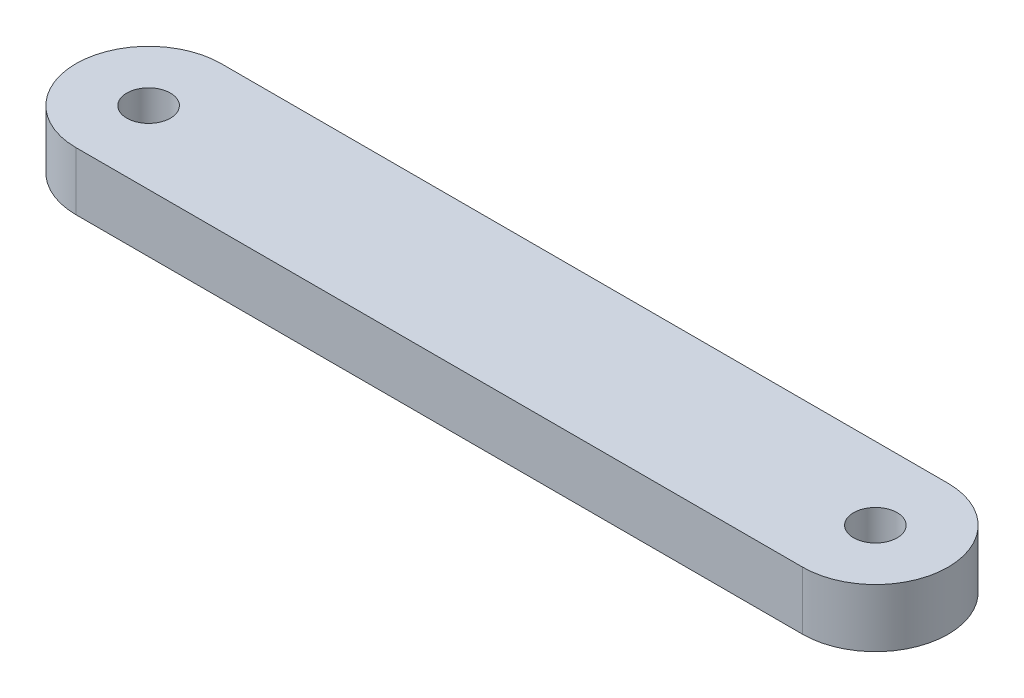
ISO-10303-21;
HEADER;
FILE_DESCRIPTION(('STEP AP214'),'2;1');
FILE_NAME('part.step','',(''),(''),'','','');
FILE_SCHEMA(('AUTOMOTIVE_DESIGN { 1 0 10303 214 1 1 1 1 }'));
ENDSEC;
DATA;
#1=APPLICATION_CONTEXT('core data for automotive mechanical design processes');
#2=APPLICATION_PROTOCOL_DEFINITION('international standard','automotive_design',2000,#1);
#3=PRODUCT_CONTEXT('',#1,'mechanical');
#4=PRODUCT('Part','Part','',(#3));
#5=PRODUCT_RELATED_PRODUCT_CATEGORY('part','',(#4));
#6=PRODUCT_DEFINITION_FORMATION('','',#4);
#7=PRODUCT_DEFINITION_CONTEXT('part definition',#1,'design');
#8=PRODUCT_DEFINITION('design','',#6,#7);
#9=PRODUCT_DEFINITION_SHAPE('','',#8);
#10=(LENGTH_UNIT() NAMED_UNIT(*) SI_UNIT(.MILLI.,.METRE.));
#11=(NAMED_UNIT(*) PLANE_ANGLE_UNIT() SI_UNIT($,.RADIAN.));
#12=(NAMED_UNIT(*) SI_UNIT($,.STERADIAN.) SOLID_ANGLE_UNIT());
#13=UNCERTAINTY_MEASURE_WITH_UNIT(LENGTH_MEASURE(1.E-05),#10,'distance_accuracy_value','');
#14=(GEOMETRIC_REPRESENTATION_CONTEXT(3) GLOBAL_UNCERTAINTY_ASSIGNED_CONTEXT((#13)) GLOBAL_UNIT_ASSIGNED_CONTEXT((#10,
#11,#12)) REPRESENTATION_CONTEXT('',''));
#15=CARTESIAN_POINT('',(0.,0.,0.));
#16=DIRECTION('',(0.,0.,1.));
#17=DIRECTION('',(1.,0.,0.));
#18=AXIS2_PLACEMENT_3D('',#15,#16,#17);
#19=CARTESIAN_POINT('',(-26.252408477842,4.,0.));
#20=DIRECTION('',(0.,1.,0.));
#21=DIRECTION('',(0.,0.,1.));
#22=AXIS2_PLACEMENT_3D('',#19,#20,#21);
#23=PLANE('',#22);
#24=CARTESIAN_POINT('',(-26.252408477842,4.,0.));
#25=DIRECTION('',(0.,1.,0.));
#26=DIRECTION('',(0.,0.,1.));
#27=AXIS2_PLACEMENT_3D('',#24,#25,#26);
#28=CIRCLE('',#27,1.5);
#29=CARTESIAN_POINT('',(-26.252408477842,4.,1.5));
#30=VERTEX_POINT('',#29);
#31=EDGE_CURVE('E118',#30,#30,#28,.T.);
#32=ORIENTED_EDGE('',*,*,#31,.F.);
#33=EDGE_LOOP('',(#32));
#34=FACE_BOUND('',#33,.T.);
#35=CARTESIAN_POINT('',(-26.252408477842,4.,0.));
#36=DIRECTION('',(0.,1.,0.));
#37=DIRECTION('',(0.,0.,1.));
#38=AXIS2_PLACEMENT_3D('',#35,#36,#37);
#39=CIRCLE('',#38,5.);
#40=CARTESIAN_POINT('',(-26.252408477842,4.,-5.));
#41=VERTEX_POINT('',#40);
#42=CARTESIAN_POINT('',(-26.252408477842,4.,5.));
#43=VERTEX_POINT('',#42);
#44=EDGE_CURVE('E98',#41,#43,#39,.T.);
#45=ORIENTED_EDGE('',*,*,#44,.T.);
#46=DIRECTION('',(1.,0.,0.));
#47=VECTOR('',#46,1.);
#48=CARTESIAN_POINT('',(-26.252408477842,4.,5.));
#49=LINE('',#48,#47);
#50=CARTESIAN_POINT('',(23.747591522158,4.,5.));
#51=VERTEX_POINT('',#50);
#52=EDGE_CURVE('E93',#43,#51,#49,.T.);
#53=ORIENTED_EDGE('',*,*,#52,.T.);
#54=CARTESIAN_POINT('',(23.747591522158,4.,0.));
#55=DIRECTION('',(0.,1.,0.));
#56=DIRECTION('',(0.,0.,1.));
#57=AXIS2_PLACEMENT_3D('',#54,#55,#56);
#58=CIRCLE('',#57,5.);
#59=CARTESIAN_POINT('',(23.747591522158,4.,-5.));
#60=VERTEX_POINT('',#59);
#61=EDGE_CURVE('E96',#51,#60,#58,.T.);
#62=ORIENTED_EDGE('',*,*,#61,.T.);
#63=DIRECTION('',(-1.,0.,0.));
#64=VECTOR('',#63,1.);
#65=CARTESIAN_POINT('',(-26.252408477842,4.,-5.));
#66=LINE('',#65,#64);
#67=EDGE_CURVE('E63',#60,#41,#66,.T.);
#68=ORIENTED_EDGE('',*,*,#67,.T.);
#69=EDGE_LOOP('',(#45,#53,#62,#68));
#70=FACE_BOUND('',#69,.T.);
#71=CARTESIAN_POINT('',(23.747591522158,4.,0.));
#72=DIRECTION('',(0.,1.,0.));
#73=DIRECTION('',(0.,0.,1.));
#74=AXIS2_PLACEMENT_3D('',#71,#72,#73);
#75=CIRCLE('',#74,1.5);
#76=CARTESIAN_POINT('',(23.747591522158,4.,1.5));
#77=VERTEX_POINT('',#76);
#78=EDGE_CURVE('E140',#77,#77,#75,.T.);
#79=ORIENTED_EDGE('',*,*,#78,.F.);
#80=EDGE_LOOP('',(#79));
#81=FACE_BOUND('',#80,.T.);
#82=ADVANCED_FACE('F45',(#34,#70,#81),#23,.T.);
#83=CARTESIAN_POINT('',(-26.252408477842,0.,0.));
#84=DIRECTION('',(0.,1.,0.));
#85=DIRECTION('',(0.,0.,1.));
#86=AXIS2_PLACEMENT_3D('',#83,#84,#85);
#87=PLANE('',#86);
#88=CARTESIAN_POINT('',(-26.252408477842,0.,0.));
#89=DIRECTION('',(0.,1.,0.));
#90=DIRECTION('',(0.,0.,1.));
#91=AXIS2_PLACEMENT_3D('',#88,#89,#90);
#92=CIRCLE('',#91,5.);
#93=CARTESIAN_POINT('',(-26.252408477842,0.,-5.));
#94=VERTEX_POINT('',#93);
#95=CARTESIAN_POINT('',(-26.252408477842,0.,5.));
#96=VERTEX_POINT('',#95);
#97=EDGE_CURVE('E114',#94,#96,#92,.T.);
#98=ORIENTED_EDGE('',*,*,#97,.F.);
#99=DIRECTION('',(-1.,0.,0.));
#100=VECTOR('',#99,1.);
#101=CARTESIAN_POINT('',(-26.252408477842,0.,-5.));
#102=LINE('',#101,#100);
#103=CARTESIAN_POINT('',(23.747591522158,0.,-5.));
#104=VERTEX_POINT('',#103);
#105=EDGE_CURVE('E86',#104,#94,#102,.T.);
#106=ORIENTED_EDGE('',*,*,#105,.F.);
#107=CARTESIAN_POINT('',(23.747591522158,0.,0.));
#108=DIRECTION('',(0.,1.,0.));
#109=DIRECTION('',(0.,0.,1.));
#110=AXIS2_PLACEMENT_3D('',#107,#108,#109);
#111=CIRCLE('',#110,5.);
#112=CARTESIAN_POINT('',(23.747591522158,0.,5.));
#113=VERTEX_POINT('',#112);
#114=EDGE_CURVE('E80',#113,#104,#111,.T.);
#115=ORIENTED_EDGE('',*,*,#114,.F.);
#116=DIRECTION('',(1.,0.,0.));
#117=VECTOR('',#116,1.);
#118=CARTESIAN_POINT('',(-26.252408477842,0.,5.));
#119=LINE('',#118,#117);
#120=EDGE_CURVE('E103',#96,#113,#119,.T.);
#121=ORIENTED_EDGE('',*,*,#120,.F.);
#122=EDGE_LOOP('',(#98,#106,#115,#121));
#123=FACE_BOUND('',#122,.T.);
#124=CARTESIAN_POINT('',(-26.252408477842,0.,0.));
#125=DIRECTION('',(0.,1.,0.));
#126=DIRECTION('',(0.,0.,1.));
#127=AXIS2_PLACEMENT_3D('',#124,#125,#126);
#128=CIRCLE('',#127,1.5);
#129=CARTESIAN_POINT('',(-26.252408477842,0.,1.5));
#130=VERTEX_POINT('',#129);
#131=EDGE_CURVE('E136',#130,#130,#128,.T.);
#132=ORIENTED_EDGE('',*,*,#131,.T.);
#133=EDGE_LOOP('',(#132));
#134=FACE_BOUND('',#133,.T.);
#135=CARTESIAN_POINT('',(23.747591522158,0.,0.));
#136=DIRECTION('',(0.,1.,0.));
#137=DIRECTION('',(0.,0.,1.));
#138=AXIS2_PLACEMENT_3D('',#135,#136,#137);
#139=CIRCLE('',#138,1.5);
#140=CARTESIAN_POINT('',(23.747591522158,0.,1.5));
#141=VERTEX_POINT('',#140);
#142=EDGE_CURVE('E144',#141,#141,#139,.T.);
#143=ORIENTED_EDGE('',*,*,#142,.T.);
#144=EDGE_LOOP('',(#143));
#145=FACE_BOUND('',#144,.T.);
#146=ADVANCED_FACE('F131',(#123,#134,#145),#87,.F.);
#147=CARTESIAN_POINT('',(-26.252408477842,4.,0.));
#148=DIRECTION('',(0.,-1.,0.));
#149=DIRECTION('',(0.,0.,-1.));
#150=AXIS2_PLACEMENT_3D('',#147,#148,#149);
#151=CYLINDRICAL_SURFACE('',#150,5.);
#152=ORIENTED_EDGE('',*,*,#97,.T.);
#153=DIRECTION('',(0.,-1.,0.));
#154=VECTOR('',#153,1.);
#155=CARTESIAN_POINT('',(-26.252408477842,4.,5.));
#156=LINE('',#155,#154);
#157=EDGE_CURVE('E11',#43,#96,#156,.T.);
#158=ORIENTED_EDGE('',*,*,#157,.F.);
#159=ORIENTED_EDGE('',*,*,#44,.F.);
#160=DIRECTION('',(0.,-1.,0.));
#161=VECTOR('',#160,1.);
#162=CARTESIAN_POINT('',(-26.252408477842,4.,-5.));
#163=LINE('',#162,#161);
#164=EDGE_CURVE('E110',#41,#94,#163,.T.);
#165=ORIENTED_EDGE('',*,*,#164,.T.);
#166=EDGE_LOOP('',(#152,#158,#159,#165));
#167=FACE_BOUND('',#166,.T.);
#168=ADVANCED_FACE('F47',(#167),#151,.T.);
#169=CARTESIAN_POINT('',(-26.252408477842,4.,5.));
#170=DIRECTION('',(0.,0.,-1.));
#171=DIRECTION('',(-1.,0.,0.));
#172=AXIS2_PLACEMENT_3D('',#169,#170,#171);
#173=PLANE('',#172);
#174=ORIENTED_EDGE('',*,*,#120,.T.);
#175=DIRECTION('',(0.,-1.,0.));
#176=VECTOR('',#175,1.);
#177=CARTESIAN_POINT('',(23.747591522158,4.,5.));
#178=LINE('',#177,#176);
#179=EDGE_CURVE('E55',#51,#113,#178,.T.);
#180=ORIENTED_EDGE('',*,*,#179,.F.);
#181=ORIENTED_EDGE('',*,*,#52,.F.);
#182=ORIENTED_EDGE('',*,*,#157,.T.);
#183=EDGE_LOOP('',(#174,#180,#181,#182));
#184=FACE_BOUND('',#183,.T.);
#185=ADVANCED_FACE('F102',(#184),#173,.F.);
#186=CARTESIAN_POINT('',(23.747591522158,4.,0.));
#187=DIRECTION('',(0.,-1.,0.));
#188=DIRECTION('',(0.,0.,-1.));
#189=AXIS2_PLACEMENT_3D('',#186,#187,#188);
#190=CYLINDRICAL_SURFACE('',#189,5.);
#191=ORIENTED_EDGE('',*,*,#114,.T.);
#192=DIRECTION('',(0.,-1.,0.));
#193=VECTOR('',#192,1.);
#194=CARTESIAN_POINT('',(23.747591522158,4.,-5.));
#195=LINE('',#194,#193);
#196=EDGE_CURVE('E105',#60,#104,#195,.T.);
#197=ORIENTED_EDGE('',*,*,#196,.F.);
#198=ORIENTED_EDGE('',*,*,#61,.F.);
#199=ORIENTED_EDGE('',*,*,#179,.T.);
#200=EDGE_LOOP('',(#191,#197,#198,#199));
#201=FACE_BOUND('',#200,.T.);
#202=ADVANCED_FACE('F106',(#201),#190,.T.);
#203=CARTESIAN_POINT('',(-26.252408477842,4.,-5.));
#204=DIRECTION('',(0.,0.,1.));
#205=DIRECTION('',(1.,0.,0.));
#206=AXIS2_PLACEMENT_3D('',#203,#204,#205);
#207=PLANE('',#206);
#208=ORIENTED_EDGE('',*,*,#105,.T.);
#209=ORIENTED_EDGE('',*,*,#164,.F.);
#210=ORIENTED_EDGE('',*,*,#67,.F.);
#211=ORIENTED_EDGE('',*,*,#196,.T.);
#212=EDGE_LOOP('',(#208,#209,#210,#211));
#213=FACE_BOUND('',#212,.T.);
#214=ADVANCED_FACE('F128',(#213),#207,.F.);
#215=CARTESIAN_POINT('',(-26.252408477842,4.,0.));
#216=DIRECTION('',(0.,-1.,0.));
#217=DIRECTION('',(0.,0.,-1.));
#218=AXIS2_PLACEMENT_3D('',#215,#216,#217);
#219=CYLINDRICAL_SURFACE('',#218,1.5);
#220=ORIENTED_EDGE('',*,*,#31,.T.);
#221=EDGE_LOOP('',(#220));
#222=FACE_BOUND('',#221,.T.);
#223=ORIENTED_EDGE('',*,*,#131,.F.);
#224=EDGE_LOOP('',(#223));
#225=FACE_BOUND('',#224,.T.);
#226=ADVANCED_FACE('F163',(#222,#225),#219,.F.);
#227=CARTESIAN_POINT('',(23.747591522158,4.,0.));
#228=DIRECTION('',(0.,-1.,0.));
#229=DIRECTION('',(0.,0.,-1.));
#230=AXIS2_PLACEMENT_3D('',#227,#228,#229);
#231=CYLINDRICAL_SURFACE('',#230,1.5);
#232=ORIENTED_EDGE('',*,*,#78,.T.);
#233=EDGE_LOOP('',(#232));
#234=FACE_BOUND('',#233,.T.);
#235=ORIENTED_EDGE('',*,*,#142,.F.);
#236=EDGE_LOOP('',(#235));
#237=FACE_BOUND('',#236,.T.);
#238=ADVANCED_FACE('F152',(#234,#237),#231,.F.);
#239=CLOSED_SHELL('',(#82,#146,#168,#185,#202,#214,#226,#238));
#240=MANIFOLD_SOLID_BREP('B2',#239);
#241=ADVANCED_BREP_SHAPE_REPRESENTATION('',(#18,#240),#14);
#242=SHAPE_DEFINITION_REPRESENTATION(#9,#241);
ENDSEC;
END-ISO-10303-21;
